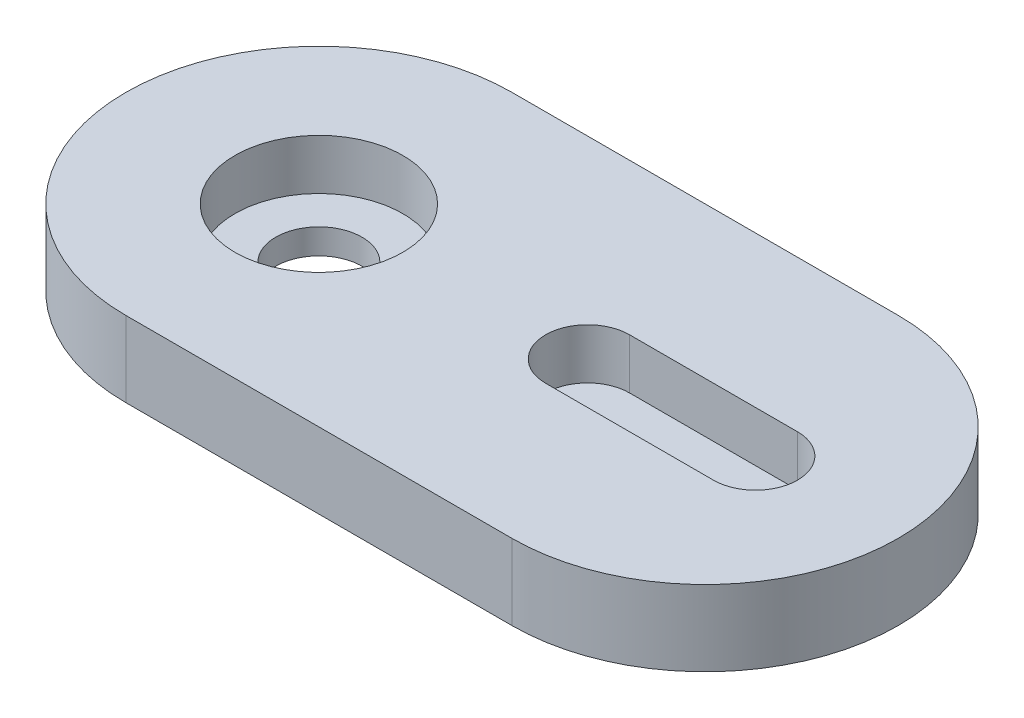
ISO-10303-21;
HEADER;
FILE_DESCRIPTION(('STEP AP214'),'2;1');
FILE_NAME('part.step','',(''),(''),'','','');
FILE_SCHEMA(('AUTOMOTIVE_DESIGN { 1 0 10303 214 1 1 1 1 }'));
ENDSEC;
DATA;
#1=APPLICATION_CONTEXT('core data for automotive mechanical design processes');
#2=APPLICATION_PROTOCOL_DEFINITION('international standard','automotive_design',2000,#1);
#3=PRODUCT_CONTEXT('',#1,'mechanical');
#4=PRODUCT('Part','Part','',(#3));
#5=PRODUCT_RELATED_PRODUCT_CATEGORY('part','',(#4));
#6=PRODUCT_DEFINITION_FORMATION('','',#4);
#7=PRODUCT_DEFINITION_CONTEXT('part definition',#1,'design');
#8=PRODUCT_DEFINITION('design','',#6,#7);
#9=PRODUCT_DEFINITION_SHAPE('','',#8);
#10=(LENGTH_UNIT() NAMED_UNIT(*) SI_UNIT(.MILLI.,.METRE.));
#11=(NAMED_UNIT(*) PLANE_ANGLE_UNIT() SI_UNIT($,.RADIAN.));
#12=(NAMED_UNIT(*) SI_UNIT($,.STERADIAN.) SOLID_ANGLE_UNIT());
#13=UNCERTAINTY_MEASURE_WITH_UNIT(LENGTH_MEASURE(1.E-05),#10,'distance_accuracy_value','');
#14=(GEOMETRIC_REPRESENTATION_CONTEXT(3) GLOBAL_UNCERTAINTY_ASSIGNED_CONTEXT((#13)) GLOBAL_UNIT_ASSIGNED_CONTEXT((#10,
#11,#12)) REPRESENTATION_CONTEXT('',''));
#15=CARTESIAN_POINT('',(0.,0.,0.));
#16=DIRECTION('',(0.,0.,1.));
#17=DIRECTION('',(1.,0.,0.));
#18=AXIS2_PLACEMENT_3D('',#15,#16,#17);
#19=CARTESIAN_POINT('',(0.,-0.1905,0.));
#20=DIRECTION('',(0.,1.,0.));
#21=DIRECTION('',(0.,0.,1.));
#22=AXIS2_PLACEMENT_3D('',#19,#20,#21);
#23=CYLINDRICAL_SURFACE('',#22,1.63195);
#24=CARTESIAN_POINT('',(0.,0.,0.));
#25=DIRECTION('',(0.,1.,0.));
#26=DIRECTION('',(0.,0.,1.));
#27=AXIS2_PLACEMENT_3D('',#24,#25,#26);
#28=CIRCLE('',#27,1.63195);
#29=CARTESIAN_POINT('',(0.,0.,1.63195));
#30=VERTEX_POINT('',#29);
#31=EDGE_CURVE('E164',#30,#30,#28,.T.);
#32=CARTESIAN_POINT('',(0.,0.9525,0.));
#33=DIRECTION('',(0.,1.,0.));
#34=DIRECTION('',(0.,0.,1.));
#35=AXIS2_PLACEMENT_3D('',#32,#33,#34);
#36=CIRCLE('',#35,1.63195);
#37=CARTESIAN_POINT('',(0.,0.9525,1.63195));
#38=VERTEX_POINT('',#37);
#39=EDGE_CURVE('E43',#38,#38,#36,.F.);
#40=CARTESIAN_POINT('',(0.,0.,1.63195));
#41=CARTESIAN_POINT('',(0.,0.00992187499999998,1.63195));
#42=CARTESIAN_POINT('',(0.,0.01984375,1.63195));
#43=CARTESIAN_POINT('',(0.,0.0396875,1.63195));
#44=CARTESIAN_POINT('',(0.,0.049609375,1.63195));
#45=CARTESIAN_POINT('',(0.,0.069453125,1.63195));
#46=CARTESIAN_POINT('',(0.,0.079375,1.63195));
#47=CARTESIAN_POINT('',(0.,0.09921875,1.63195));
#48=CARTESIAN_POINT('',(0.,0.109140625,1.63195));
#49=CARTESIAN_POINT('',(0.,0.128984375,1.63195));
#50=CARTESIAN_POINT('',(0.,0.13890625,1.63195));
#51=CARTESIAN_POINT('',(0.,0.15875,1.63195));
#52=CARTESIAN_POINT('',(0.,0.168671875,1.63195));
#53=CARTESIAN_POINT('',(0.,0.188515625,1.63195));
#54=CARTESIAN_POINT('',(0.,0.1984375,1.63195));
#55=CARTESIAN_POINT('',(0.,0.21828125,1.63195));
#56=CARTESIAN_POINT('',(0.,0.228203125,1.63195));
#57=CARTESIAN_POINT('',(0.,0.248046875,1.63195));
#58=CARTESIAN_POINT('',(0.,0.25796875,1.63195));
#59=CARTESIAN_POINT('',(0.,0.2778125,1.63195));
#60=CARTESIAN_POINT('',(0.,0.287734375,1.63195));
#61=CARTESIAN_POINT('',(0.,0.307578125,1.63195));
#62=CARTESIAN_POINT('',(0.,0.3175,1.63195));
#63=CARTESIAN_POINT('',(0.,0.33734375,1.63195));
#64=CARTESIAN_POINT('',(0.,0.347265625,1.63195));
#65=CARTESIAN_POINT('',(0.,0.367109375,1.63195));
#66=CARTESIAN_POINT('',(0.,0.37703125,1.63195));
#67=CARTESIAN_POINT('',(0.,0.396875,1.63195));
#68=CARTESIAN_POINT('',(0.,0.406796875,1.63195));
#69=CARTESIAN_POINT('',(0.,0.426640625,1.63195));
#70=CARTESIAN_POINT('',(0.,0.4365625,1.63195));
#71=CARTESIAN_POINT('',(0.,0.45640625,1.63195));
#72=CARTESIAN_POINT('',(0.,0.466328125,1.63195));
#73=CARTESIAN_POINT('',(0.,0.486171875,1.63195));
#74=CARTESIAN_POINT('',(0.,0.49609375,1.63195));
#75=CARTESIAN_POINT('',(0.,0.5159375,1.63195));
#76=CARTESIAN_POINT('',(0.,0.525859375,1.63195));
#77=CARTESIAN_POINT('',(0.,0.545703125,1.63195));
#78=CARTESIAN_POINT('',(0.,0.555625,1.63195));
#79=CARTESIAN_POINT('',(0.,0.57546875,1.63195));
#80=CARTESIAN_POINT('',(0.,0.585390625,1.63195));
#81=CARTESIAN_POINT('',(0.,0.605234375,1.63195));
#82=CARTESIAN_POINT('',(0.,0.61515625,1.63195));
#83=CARTESIAN_POINT('',(0.,0.635,1.63195));
#84=CARTESIAN_POINT('',(0.,0.644921875,1.63195));
#85=CARTESIAN_POINT('',(0.,0.664765625,1.63195));
#86=CARTESIAN_POINT('',(0.,0.6746875,1.63195));
#87=CARTESIAN_POINT('',(0.,0.69453125,1.63195));
#88=CARTESIAN_POINT('',(0.,0.704453125,1.63195));
#89=CARTESIAN_POINT('',(0.,0.724296875,1.63195));
#90=CARTESIAN_POINT('',(0.,0.73421875,1.63195));
#91=CARTESIAN_POINT('',(0.,0.7540625,1.63195));
#92=CARTESIAN_POINT('',(0.,0.763984375,1.63195));
#93=CARTESIAN_POINT('',(0.,0.783828125,1.63195));
#94=CARTESIAN_POINT('',(0.,0.79375,1.63195));
#95=CARTESIAN_POINT('',(0.,0.81359375,1.63195));
#96=CARTESIAN_POINT('',(0.,0.823515625,1.63195));
#97=CARTESIAN_POINT('',(0.,0.843359375,1.63195));
#98=CARTESIAN_POINT('',(0.,0.85328125,1.63195));
#99=CARTESIAN_POINT('',(0.,0.873125,1.63195));
#100=CARTESIAN_POINT('',(0.,0.883046875,1.63195));
#101=CARTESIAN_POINT('',(0.,0.902890625,1.63195));
#102=CARTESIAN_POINT('',(0.,0.9128125,1.63195));
#103=CARTESIAN_POINT('',(0.,0.93265625,1.63195));
#104=CARTESIAN_POINT('',(0.,0.942578125,1.63195));
#105=CARTESIAN_POINT('',(0.,0.9525,1.63195));
#106=B_SPLINE_CURVE_WITH_KNOTS('',3,(#40,#41,#42,#43,#44,#45,#46,#47,#48,#49,#50,#51,#52,#53,
#54,#55,#56,#57,#58,#59,#60,#61,#62,#63,#64,#65,#66,#67,#68,#69,#70,#71,#72,#73,#74,#75,#76,#77,
#78,#79,#80,#81,#82,#83,#84,#85,#86,#87,#88,#89,#90,#91,#92,#93,#94,#95,#96,#97,#98,#99,#100,
#101,#102,#103,#104,#105),.UNSPECIFIED.,.F.,.F.,(4,2,2,2,2,2,2,2,2,2,2,2,2,2,2,2,2,2,2,2,2,2,2,
2,2,2,2,2,2,2,2,2,4),(0.,0.029765625,0.05953125,0.089296875,0.1190625,0.148828125,0.17859375,
0.208359375,0.238125,0.267890625,0.29765625,0.327421875,0.3571875,0.386953125,0.41671875,
0.446484375,0.47625,0.506015625,0.53578125,0.565546875,0.5953125,0.625078125,0.65484375,
0.684609375,0.714375,0.744140625,0.77390625,0.803671875,0.8334375,0.863203125,0.89296875,
0.922734375,0.9525),.UNSPECIFIED.);
#107=EDGE_CURVE('BSEAM39',#30,#38,#106,.T.);
#108=ORIENTED_EDGE('',*,*,#31,.F.);
#109=ORIENTED_EDGE('',*,*,#39,.F.);
#110=ORIENTED_EDGE('',*,*,#107,.T.);
#111=ORIENTED_EDGE('',*,*,#107,.F.);
#112=EDGE_LOOP('',(#108,#110,#109,#111));
#113=FACE_BOUND('',#112,.T.);
#114=ADVANCED_FACE('F39',(#113),#23,.F.);
#115=CARTESIAN_POINT('',(14.605,2.8575,0.));
#116=DIRECTION('',(0.,-1.,0.));
#117=DIRECTION('',(0.,0.,-1.));
#118=AXIS2_PLACEMENT_3D('',#115,#116,#117);
#119=CYLINDRICAL_SURFACE('',#118,7.3025);
#120=CARTESIAN_POINT('',(14.605,0.,0.));
#121=DIRECTION('',(0.,1.,0.));
#122=DIRECTION('',(0.,0.,1.));
#123=AXIS2_PLACEMENT_3D('',#120,#121,#122);
#124=CIRCLE('',#123,7.3025);
#125=CARTESIAN_POINT('',(14.605,0.,7.3025));
#126=VERTEX_POINT('',#125);
#127=CARTESIAN_POINT('',(14.605,0.,-7.3025));
#128=VERTEX_POINT('',#127);
#129=EDGE_CURVE('E160',#126,#128,#124,.T.);
#130=ORIENTED_EDGE('',*,*,#129,.T.);
#131=DIRECTION('',(0.,-1.,0.));
#132=VECTOR('',#131,1.);
#133=CARTESIAN_POINT('',(14.605,2.8575,-7.3025));
#134=LINE('',#133,#132);
#135=CARTESIAN_POINT('',(14.605,2.8575,-7.3025));
#136=VERTEX_POINT('',#135);
#137=EDGE_CURVE('E11',#136,#128,#134,.T.);
#138=ORIENTED_EDGE('',*,*,#137,.F.);
#139=CARTESIAN_POINT('',(14.605,2.8575,0.));
#140=DIRECTION('',(0.,1.,0.));
#141=DIRECTION('',(0.,0.,1.));
#142=AXIS2_PLACEMENT_3D('',#139,#140,#141);
#143=CIRCLE('',#142,7.3025);
#144=CARTESIAN_POINT('',(14.605,2.8575,7.3025));
#145=VERTEX_POINT('',#144);
#146=EDGE_CURVE('E153',#145,#136,#143,.T.);
#147=ORIENTED_EDGE('',*,*,#146,.F.);
#148=DIRECTION('',(0.,-1.,0.));
#149=VECTOR('',#148,1.);
#150=CARTESIAN_POINT('',(14.605,2.8575,7.3025));
#151=LINE('',#150,#149);
#152=EDGE_CURVE('E159',#145,#126,#151,.T.);
#153=ORIENTED_EDGE('',*,*,#152,.T.);
#154=EDGE_LOOP('',(#130,#138,#147,#153));
#155=FACE_BOUND('',#154,.T.);
#156=ADVANCED_FACE('F41',(#155),#119,.T.);
#157=CARTESIAN_POINT('',(14.605,2.8575,-7.3025));
#158=DIRECTION('',(0.,0.,1.));
#159=DIRECTION('',(1.,0.,0.));
#160=AXIS2_PLACEMENT_3D('',#157,#158,#159);
#161=PLANE('',#160);
#162=DIRECTION('',(-1.,0.,0.));
#163=VECTOR('',#162,1.);
#164=CARTESIAN_POINT('',(14.605,0.,-7.3025));
#165=LINE('',#164,#163);
#166=CARTESIAN_POINT('',(0.,0.,-7.3025));
#167=VERTEX_POINT('',#166);
#168=EDGE_CURVE('E163',#128,#167,#165,.T.);
#169=ORIENTED_EDGE('',*,*,#168,.T.);
#170=DIRECTION('',(0.,-1.,0.));
#171=VECTOR('',#170,1.);
#172=CARTESIAN_POINT('',(0.,2.8575,-7.3025));
#173=LINE('',#172,#171);
#174=CARTESIAN_POINT('',(0.,2.8575,-7.3025));
#175=VERTEX_POINT('',#174);
#176=EDGE_CURVE('E48',#175,#167,#173,.T.);
#177=ORIENTED_EDGE('',*,*,#176,.F.);
#178=DIRECTION('',(-1.,0.,0.));
#179=VECTOR('',#178,1.);
#180=CARTESIAN_POINT('',(14.605,2.8575,-7.3025));
#181=LINE('',#180,#179);
#182=EDGE_CURVE('E93',#136,#175,#181,.T.);
#183=ORIENTED_EDGE('',*,*,#182,.F.);
#184=ORIENTED_EDGE('',*,*,#137,.T.);
#185=EDGE_LOOP('',(#169,#177,#183,#184));
#186=FACE_BOUND('',#185,.T.);
#187=ADVANCED_FACE('F210',(#186),#161,.F.);
#188=CARTESIAN_POINT('',(0.,2.8575,0.));
#189=DIRECTION('',(0.,-1.,0.));
#190=DIRECTION('',(0.,0.,-1.));
#191=AXIS2_PLACEMENT_3D('',#188,#189,#190);
#192=CYLINDRICAL_SURFACE('',#191,7.3025);
#193=CARTESIAN_POINT('',(0.,0.,0.));
#194=DIRECTION('',(0.,1.,0.));
#195=DIRECTION('',(0.,0.,1.));
#196=AXIS2_PLACEMENT_3D('',#193,#194,#195);
#197=CIRCLE('',#196,7.3025);
#198=CARTESIAN_POINT('',(0.,0.,7.3025));
#199=VERTEX_POINT('',#198);
#200=EDGE_CURVE('E166',#167,#199,#197,.T.);
#201=ORIENTED_EDGE('',*,*,#200,.T.);
#202=DIRECTION('',(0.,-1.,0.));
#203=VECTOR('',#202,1.);
#204=CARTESIAN_POINT('',(0.,2.8575,7.3025));
#205=LINE('',#204,#203);
#206=CARTESIAN_POINT('',(0.,2.8575,7.3025));
#207=VERTEX_POINT('',#206);
#208=EDGE_CURVE('E170',#207,#199,#205,.T.);
#209=ORIENTED_EDGE('',*,*,#208,.F.);
#210=CARTESIAN_POINT('',(0.,2.8575,0.));
#211=DIRECTION('',(0.,1.,0.));
#212=DIRECTION('',(0.,0.,1.));
#213=AXIS2_PLACEMENT_3D('',#210,#211,#212);
#214=CIRCLE('',#213,7.3025);
#215=EDGE_CURVE('E156',#175,#207,#214,.T.);
#216=ORIENTED_EDGE('',*,*,#215,.F.);
#217=ORIENTED_EDGE('',*,*,#176,.T.);
#218=EDGE_LOOP('',(#201,#209,#216,#217));
#219=FACE_BOUND('',#218,.T.);
#220=ADVANCED_FACE('F222',(#219),#192,.T.);
#221=CARTESIAN_POINT('',(14.605,2.8575,7.3025));
#222=DIRECTION('',(0.,0.,-1.));
#223=DIRECTION('',(-1.,0.,0.));
#224=AXIS2_PLACEMENT_3D('',#221,#222,#223);
#225=PLANE('',#224);
#226=DIRECTION('',(1.,0.,0.));
#227=VECTOR('',#226,1.);
#228=CARTESIAN_POINT('',(14.605,0.,7.3025));
#229=LINE('',#228,#227);
#230=EDGE_CURVE('E86',#199,#126,#229,.T.);
#231=ORIENTED_EDGE('',*,*,#230,.T.);
#232=ORIENTED_EDGE('',*,*,#152,.F.);
#233=DIRECTION('',(1.,0.,0.));
#234=VECTOR('',#233,1.);
#235=CARTESIAN_POINT('',(14.605,2.8575,7.3025));
#236=LINE('',#235,#234);
#237=EDGE_CURVE('E65',#207,#145,#236,.T.);
#238=ORIENTED_EDGE('',*,*,#237,.F.);
#239=ORIENTED_EDGE('',*,*,#208,.T.);
#240=EDGE_LOOP('',(#231,#232,#238,#239));
#241=FACE_BOUND('',#240,.T.);
#242=ADVANCED_FACE('F216',(#241),#225,.F.);
#243=CARTESIAN_POINT('',(14.605,2.8575,0.));
#244=DIRECTION('',(0.,1.,0.));
#245=DIRECTION('',(0.,0.,1.));
#246=AXIS2_PLACEMENT_3D('',#243,#244,#245);
#247=PLANE('',#246);
#248=CARTESIAN_POINT('',(0.,2.8575,0.));
#249=DIRECTION('',(0.,1.,0.));
#250=DIRECTION('',(0.,0.,1.));
#251=AXIS2_PLACEMENT_3D('',#248,#249,#250);
#252=CIRCLE('',#251,3.175);
#253=CARTESIAN_POINT('',(0.,2.8575,3.175));
#254=VERTEX_POINT('',#253);
#255=EDGE_CURVE('E135',#254,#254,#252,.T.);
#256=ORIENTED_EDGE('',*,*,#255,.F.);
#257=EDGE_LOOP('',(#256));
#258=FACE_BOUND('',#257,.T.);
#259=CARTESIAN_POINT('',(10.16,2.8575,0.));
#260=DIRECTION('',(0.,1.,0.));
#261=DIRECTION('',(0.,0.,1.));
#262=AXIS2_PLACEMENT_3D('',#259,#260,#261);
#263=CIRCLE('',#262,1.5875);
#264=CARTESIAN_POINT('',(10.16,2.8575,-1.5875));
#265=VERTEX_POINT('',#264);
#266=CARTESIAN_POINT('',(10.16,2.8575,1.5875));
#267=VERTEX_POINT('',#266);
#268=EDGE_CURVE('E56',#265,#267,#263,.T.);
#269=ORIENTED_EDGE('',*,*,#268,.F.);
#270=DIRECTION('',(-1.,0.,0.));
#271=VECTOR('',#270,1.);
#272=CARTESIAN_POINT('',(10.16,2.8575,-1.5875));
#273=LINE('',#272,#271);
#274=CARTESIAN_POINT('',(16.51,2.8575,-1.5875));
#275=VERTEX_POINT('',#274);
#276=EDGE_CURVE('E124',#275,#265,#273,.T.);
#277=ORIENTED_EDGE('',*,*,#276,.F.);
#278=CARTESIAN_POINT('',(16.51,2.8575,0.));
#279=DIRECTION('',(0.,1.,0.));
#280=DIRECTION('',(0.,0.,1.));
#281=AXIS2_PLACEMENT_3D('',#278,#279,#280);
#282=CIRCLE('',#281,1.5875);
#283=CARTESIAN_POINT('',(16.51,2.8575,1.5875));
#284=VERTEX_POINT('',#283);
#285=EDGE_CURVE('E129',#284,#275,#282,.T.);
#286=ORIENTED_EDGE('',*,*,#285,.F.);
#287=DIRECTION('',(1.,0.,0.));
#288=VECTOR('',#287,1.);
#289=CARTESIAN_POINT('',(10.16,2.8575,1.5875));
#290=LINE('',#289,#288);
#291=EDGE_CURVE('E134',#267,#284,#290,.T.);
#292=ORIENTED_EDGE('',*,*,#291,.F.);
#293=EDGE_LOOP('',(#269,#277,#286,#292));
#294=FACE_BOUND('',#293,.T.);
#295=ORIENTED_EDGE('',*,*,#146,.T.);
#296=ORIENTED_EDGE('',*,*,#182,.T.);
#297=ORIENTED_EDGE('',*,*,#215,.T.);
#298=ORIENTED_EDGE('',*,*,#237,.T.);
#299=EDGE_LOOP('',(#295,#296,#297,#298));
#300=FACE_BOUND('',#299,.T.);
#301=ADVANCED_FACE('F132',(#258,#294,#300),#247,.T.);
#302=CARTESIAN_POINT('',(14.605,0.,0.));
#303=DIRECTION('',(0.,1.,0.));
#304=DIRECTION('',(0.,0.,1.));
#305=AXIS2_PLACEMENT_3D('',#302,#303,#304);
#306=PLANE('',#305);
#307=ORIENTED_EDGE('',*,*,#31,.T.);
#308=EDGE_LOOP('',(#307));
#309=FACE_BOUND('',#308,.T.);
#310=ORIENTED_EDGE('',*,*,#129,.F.);
#311=ORIENTED_EDGE('',*,*,#230,.F.);
#312=ORIENTED_EDGE('',*,*,#200,.F.);
#313=ORIENTED_EDGE('',*,*,#168,.F.);
#314=EDGE_LOOP('',(#310,#311,#312,#313));
#315=FACE_BOUND('',#314,.T.);
#316=ADVANCED_FACE('F215',(#309,#315),#306,.F.);
#317=CARTESIAN_POINT('',(0.,0.9525,0.));
#318=DIRECTION('',(0.,1.,0.));
#319=DIRECTION('',(0.,0.,1.));
#320=AXIS2_PLACEMENT_3D('',#317,#318,#319);
#321=PLANE('',#320);
#322=CARTESIAN_POINT('',(0.,0.9525,0.));
#323=DIRECTION('',(0.,1.,0.));
#324=DIRECTION('',(0.,0.,1.));
#325=AXIS2_PLACEMENT_3D('',#322,#323,#324);
#326=CIRCLE('',#325,3.175);
#327=CARTESIAN_POINT('',(0.,0.9525,3.175));
#328=VERTEX_POINT('',#327);
#329=EDGE_CURVE('E138',#328,#328,#326,.T.);
#330=ORIENTED_EDGE('',*,*,#329,.T.);
#331=EDGE_LOOP('',(#330));
#332=FACE_BOUND('',#331,.T.);
#333=ORIENTED_EDGE('',*,*,#39,.T.);
#334=EDGE_LOOP('',(#333));
#335=FACE_BOUND('',#334,.T.);
#336=ADVANCED_FACE('F219',(#332,#335),#321,.T.);
#337=CARTESIAN_POINT('',(0.,0.9525,0.));
#338=DIRECTION('',(0.,1.,0.));
#339=DIRECTION('',(0.,0.,1.));
#340=AXIS2_PLACEMENT_3D('',#337,#338,#339);
#341=CYLINDRICAL_SURFACE('',#340,3.175);
#342=CARTESIAN_POINT('',(0.,0.9525,3.175));
#343=CARTESIAN_POINT('',(0.,0.97234375,3.175));
#344=CARTESIAN_POINT('',(0.,0.9921875,3.175));
#345=CARTESIAN_POINT('',(0.,1.031875,3.175));
#346=CARTESIAN_POINT('',(0.,1.05171875,3.175));
#347=CARTESIAN_POINT('',(0.,1.09140625,3.175));
#348=CARTESIAN_POINT('',(0.,1.11125,3.175));
#349=CARTESIAN_POINT('',(0.,1.1509375,3.175));
#350=CARTESIAN_POINT('',(0.,1.17078125,3.175));
#351=CARTESIAN_POINT('',(0.,1.21046875,3.175));
#352=CARTESIAN_POINT('',(0.,1.2303125,3.175));
#353=CARTESIAN_POINT('',(0.,1.27,3.175));
#354=CARTESIAN_POINT('',(0.,1.28984375,3.175));
#355=CARTESIAN_POINT('',(0.,1.32953125,3.175));
#356=CARTESIAN_POINT('',(0.,1.349375,3.175));
#357=CARTESIAN_POINT('',(0.,1.3890625,3.175));
#358=CARTESIAN_POINT('',(0.,1.40890625,3.175));
#359=CARTESIAN_POINT('',(0.,1.44859375,3.175));
#360=CARTESIAN_POINT('',(0.,1.4684375,3.175));
#361=CARTESIAN_POINT('',(0.,1.508125,3.175));
#362=CARTESIAN_POINT('',(0.,1.52796875,3.175));
#363=CARTESIAN_POINT('',(0.,1.56765625,3.175));
#364=CARTESIAN_POINT('',(0.,1.5875,3.175));
#365=CARTESIAN_POINT('',(0.,1.6271875,3.175));
#366=CARTESIAN_POINT('',(0.,1.64703125,3.175));
#367=CARTESIAN_POINT('',(0.,1.68671875,3.175));
#368=CARTESIAN_POINT('',(0.,1.7065625,3.175));
#369=CARTESIAN_POINT('',(0.,1.74625,3.175));
#370=CARTESIAN_POINT('',(0.,1.76609375,3.175));
#371=CARTESIAN_POINT('',(0.,1.80578125,3.175));
#372=CARTESIAN_POINT('',(0.,1.825625,3.175));
#373=CARTESIAN_POINT('',(0.,1.8653125,3.175));
#374=CARTESIAN_POINT('',(0.,1.88515625,3.175));
#375=CARTESIAN_POINT('',(0.,1.92484375,3.175));
#376=CARTESIAN_POINT('',(0.,1.9446875,3.175));
#377=CARTESIAN_POINT('',(0.,1.984375,3.175));
#378=CARTESIAN_POINT('',(0.,2.00421875,3.175));
#379=CARTESIAN_POINT('',(0.,2.04390625,3.175));
#380=CARTESIAN_POINT('',(0.,2.06375,3.175));
#381=CARTESIAN_POINT('',(0.,2.1034375,3.175));
#382=CARTESIAN_POINT('',(0.,2.12328125,3.175));
#383=CARTESIAN_POINT('',(0.,2.16296875,3.175));
#384=CARTESIAN_POINT('',(0.,2.1828125,3.175));
#385=CARTESIAN_POINT('',(0.,2.2225,3.175));
#386=CARTESIAN_POINT('',(0.,2.24234375,3.175));
#387=CARTESIAN_POINT('',(0.,2.28203125,3.175));
#388=CARTESIAN_POINT('',(0.,2.301875,3.175));
#389=CARTESIAN_POINT('',(0.,2.3415625,3.175));
#390=CARTESIAN_POINT('',(0.,2.36140625,3.175));
#391=CARTESIAN_POINT('',(0.,2.40109375,3.175));
#392=CARTESIAN_POINT('',(0.,2.4209375,3.175));
#393=CARTESIAN_POINT('',(0.,2.460625,3.175));
#394=CARTESIAN_POINT('',(0.,2.48046875,3.175));
#395=CARTESIAN_POINT('',(0.,2.52015625,3.175));
#396=CARTESIAN_POINT('',(0.,2.54,3.175));
#397=CARTESIAN_POINT('',(0.,2.5796875,3.175));
#398=CARTESIAN_POINT('',(0.,2.59953125,3.175));
#399=CARTESIAN_POINT('',(0.,2.63921875,3.175));
#400=CARTESIAN_POINT('',(0.,2.6590625,3.175));
#401=CARTESIAN_POINT('',(0.,2.69875,3.175));
#402=CARTESIAN_POINT('',(0.,2.71859375,3.175));
#403=CARTESIAN_POINT('',(0.,2.75828125,3.175));
#404=CARTESIAN_POINT('',(0.,2.778125,3.175));
#405=CARTESIAN_POINT('',(0.,2.8178125,3.175));
#406=CARTESIAN_POINT('',(0.,2.83765625,3.175));
#407=CARTESIAN_POINT('',(0.,2.8575,3.175));
#408=B_SPLINE_CURVE_WITH_KNOTS('',3,(#342,#343,#344,#345,#346,#347,#348,#349,#350,#351,#352,
#353,#354,#355,#356,#357,#358,#359,#360,#361,#362,#363,#364,#365,#366,#367,#368,#369,#370,#371,
#372,#373,#374,#375,#376,#377,#378,#379,#380,#381,#382,#383,#384,#385,#386,#387,#388,#389,#390,
#391,#392,#393,#394,#395,#396,#397,#398,#399,#400,#401,#402,#403,#404,#405,#406,#407),
.UNSPECIFIED.,.F.,.F.,(4,2,2,2,2,2,2,2,2,2,2,2,2,2,2,2,2,2,2,2,2,2,2,2,2,2,2,2,2,2,2,2,4),(0.,
0.05953125,0.1190625,0.17859375,0.238125,0.29765625,0.3571875,0.41671875,0.47625,0.53578125,
0.5953125,0.65484375,0.714375,0.77390625,0.8334375,0.89296875,0.9525,1.01203125,1.0715625,
1.13109375,1.190625,1.25015625,1.3096875,1.36921875,1.42875,1.48828125,1.5478125,1.60734375,
1.666875,1.72640625,1.7859375,1.84546875,1.905),.UNSPECIFIED.);
#409=EDGE_CURVE('BSEAM270',#328,#254,#408,.T.);
#410=ORIENTED_EDGE('',*,*,#329,.F.);
#411=ORIENTED_EDGE('',*,*,#255,.T.);
#412=ORIENTED_EDGE('',*,*,#409,.T.);
#413=ORIENTED_EDGE('',*,*,#409,.F.);
#414=EDGE_LOOP('',(#410,#412,#411,#413));
#415=FACE_BOUND('',#414,.T.);
#416=ADVANCED_FACE('F270',(#415),#341,.F.);
#417=CARTESIAN_POINT('',(10.16,0.9525,0.));
#418=DIRECTION('',(0.,1.,0.));
#419=DIRECTION('',(0.,0.,1.));
#420=AXIS2_PLACEMENT_3D('',#417,#418,#419);
#421=CYLINDRICAL_SURFACE('',#420,1.5875);
#422=ORIENTED_EDGE('',*,*,#268,.T.);
#423=DIRECTION('',(0.,1.,0.));
#424=VECTOR('',#423,1.);
#425=CARTESIAN_POINT('',(10.16,0.9525,1.5875));
#426=LINE('',#425,#424);
#427=CARTESIAN_POINT('',(10.16,0.9525,1.5875));
#428=VERTEX_POINT('',#427);
#429=EDGE_CURVE('E146',#428,#267,#426,.T.);
#430=ORIENTED_EDGE('',*,*,#429,.F.);
#431=CARTESIAN_POINT('',(10.16,0.9525,0.));
#432=DIRECTION('',(0.,1.,0.));
#433=DIRECTION('',(0.,0.,1.));
#434=AXIS2_PLACEMENT_3D('',#431,#432,#433);
#435=CIRCLE('',#434,1.5875);
#436=CARTESIAN_POINT('',(10.16,0.9525,-1.5875));
#437=VERTEX_POINT('',#436);
#438=EDGE_CURVE('E117',#437,#428,#435,.T.);
#439=ORIENTED_EDGE('',*,*,#438,.F.);
#440=DIRECTION('',(0.,1.,0.));
#441=VECTOR('',#440,1.);
#442=CARTESIAN_POINT('',(10.16,0.9525,-1.5875));
#443=LINE('',#442,#441);
#444=EDGE_CURVE('E113',#437,#265,#443,.T.);
#445=ORIENTED_EDGE('',*,*,#444,.T.);
#446=EDGE_LOOP('',(#422,#430,#439,#445));
#447=FACE_BOUND('',#446,.T.);
#448=ADVANCED_FACE('F115',(#447),#421,.F.);
#449=CARTESIAN_POINT('',(10.16,0.9525,-1.5875));
#450=DIRECTION('',(0.,0.,-1.));
#451=DIRECTION('',(-1.,0.,0.));
#452=AXIS2_PLACEMENT_3D('',#449,#450,#451);
#453=PLANE('',#452);
#454=ORIENTED_EDGE('',*,*,#276,.T.);
#455=ORIENTED_EDGE('',*,*,#444,.F.);
#456=DIRECTION('',(-1.,0.,0.));
#457=VECTOR('',#456,1.);
#458=CARTESIAN_POINT('',(10.16,0.9525,-1.5875));
#459=LINE('',#458,#457);
#460=CARTESIAN_POINT('',(16.51,0.9525,-1.5875));
#461=VERTEX_POINT('',#460);
#462=EDGE_CURVE('E143',#461,#437,#459,.T.);
#463=ORIENTED_EDGE('',*,*,#462,.F.);
#464=DIRECTION('',(0.,1.,0.));
#465=VECTOR('',#464,1.);
#466=CARTESIAN_POINT('',(16.51,0.9525,-1.5875));
#467=LINE('',#466,#465);
#468=EDGE_CURVE('E121',#461,#275,#467,.T.);
#469=ORIENTED_EDGE('',*,*,#468,.T.);
#470=EDGE_LOOP('',(#454,#455,#463,#469));
#471=FACE_BOUND('',#470,.T.);
#472=ADVANCED_FACE('F125',(#471),#453,.F.);
#473=CARTESIAN_POINT('',(16.51,0.9525,0.));
#474=DIRECTION('',(0.,1.,0.));
#475=DIRECTION('',(0.,0.,1.));
#476=AXIS2_PLACEMENT_3D('',#473,#474,#475);
#477=CYLINDRICAL_SURFACE('',#476,1.5875);
#478=ORIENTED_EDGE('',*,*,#285,.T.);
#479=ORIENTED_EDGE('',*,*,#468,.F.);
#480=CARTESIAN_POINT('',(16.51,0.9525,0.));
#481=DIRECTION('',(0.,1.,0.));
#482=DIRECTION('',(0.,0.,1.));
#483=AXIS2_PLACEMENT_3D('',#480,#481,#482);
#484=CIRCLE('',#483,1.5875);
#485=CARTESIAN_POINT('',(16.51,0.9525,1.5875));
#486=VERTEX_POINT('',#485);
#487=EDGE_CURVE('E145',#486,#461,#484,.T.);
#488=ORIENTED_EDGE('',*,*,#487,.F.);
#489=DIRECTION('',(0.,1.,0.));
#490=VECTOR('',#489,1.);
#491=CARTESIAN_POINT('',(16.51,0.9525,1.5875));
#492=LINE('',#491,#490);
#493=EDGE_CURVE('E185',#486,#284,#492,.T.);
#494=ORIENTED_EDGE('',*,*,#493,.T.);
#495=EDGE_LOOP('',(#478,#479,#488,#494));
#496=FACE_BOUND('',#495,.T.);
#497=ADVANCED_FACE('F188',(#496),#477,.F.);
#498=CARTESIAN_POINT('',(10.16,0.9525,1.5875));
#499=DIRECTION('',(0.,0.,1.));
#500=DIRECTION('',(1.,0.,0.));
#501=AXIS2_PLACEMENT_3D('',#498,#499,#500);
#502=PLANE('',#501);
#503=ORIENTED_EDGE('',*,*,#291,.T.);
#504=ORIENTED_EDGE('',*,*,#493,.F.);
#505=DIRECTION('',(1.,0.,0.));
#506=VECTOR('',#505,1.);
#507=CARTESIAN_POINT('',(10.16,0.9525,1.5875));
#508=LINE('',#507,#506);
#509=EDGE_CURVE('E149',#428,#486,#508,.T.);
#510=ORIENTED_EDGE('',*,*,#509,.F.);
#511=ORIENTED_EDGE('',*,*,#429,.T.);
#512=EDGE_LOOP('',(#503,#504,#510,#511));
#513=FACE_BOUND('',#512,.T.);
#514=ADVANCED_FACE('F192',(#513),#502,.F.);
#515=CARTESIAN_POINT('',(10.16,0.9525,0.));
#516=DIRECTION('',(0.,1.,0.));
#517=DIRECTION('',(0.,0.,1.));
#518=AXIS2_PLACEMENT_3D('',#515,#516,#517);
#519=PLANE('',#518);
#520=ORIENTED_EDGE('',*,*,#438,.T.);
#521=ORIENTED_EDGE('',*,*,#509,.T.);
#522=ORIENTED_EDGE('',*,*,#487,.T.);
#523=ORIENTED_EDGE('',*,*,#462,.T.);
#524=EDGE_LOOP('',(#520,#521,#522,#523));
#525=FACE_BOUND('',#524,.T.);
#526=ADVANCED_FACE('F194',(#525),#519,.T.);
#527=CLOSED_SHELL('',(#114,#156,#187,#220,#242,#301,#316,#336,#416,#448,#472,#497,#514,#526));
#528=MANIFOLD_SOLID_BREP('B2',#527);
#529=ADVANCED_BREP_SHAPE_REPRESENTATION('',(#18,#528),#14);
#530=SHAPE_DEFINITION_REPRESENTATION(#9,#529);
ENDSEC;
END-ISO-10303-21;
